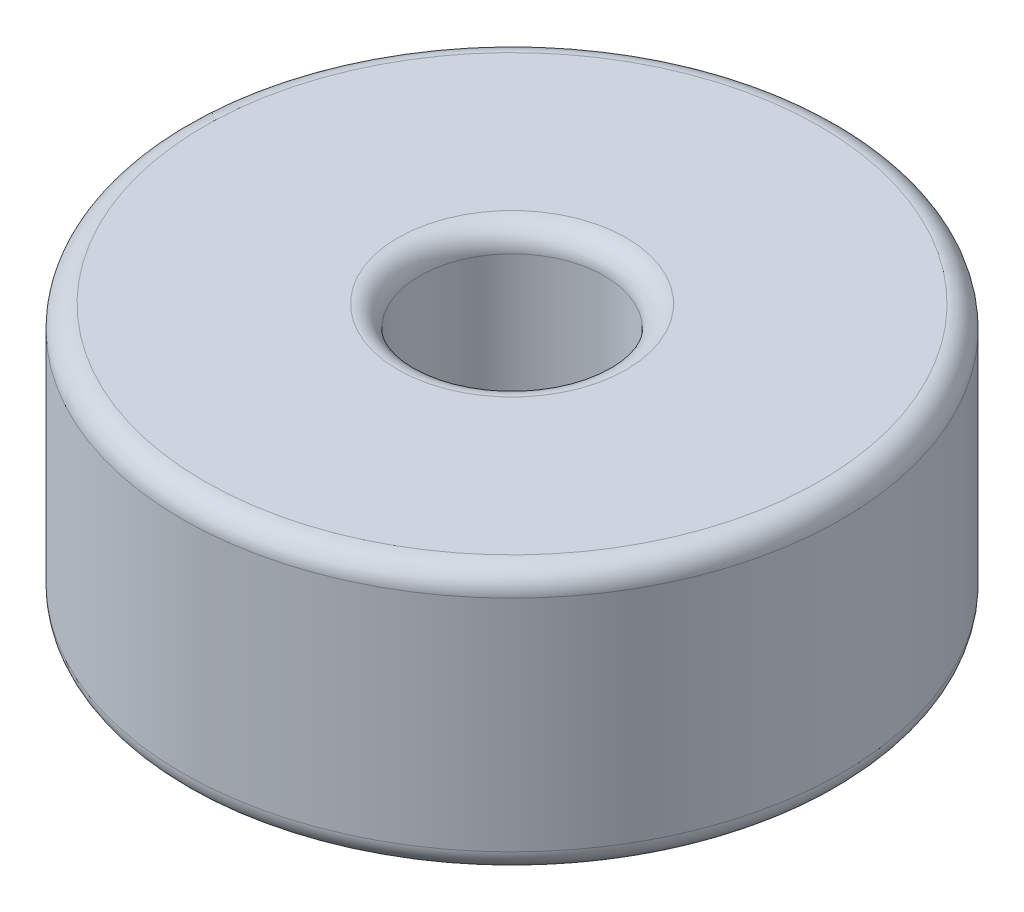
ISO-10303-21;
HEADER;
FILE_DESCRIPTION(('STEP AP214'),'2;1');
FILE_NAME('part.step','',(''),(''),'','','');
FILE_SCHEMA(('AUTOMOTIVE_DESIGN { 1 0 10303 214 1 1 1 1 }'));
ENDSEC;
DATA;
#1=APPLICATION_CONTEXT('core data for automotive mechanical design processes');
#2=APPLICATION_PROTOCOL_DEFINITION('international standard','automotive_design',2000,#1);
#3=PRODUCT_CONTEXT('',#1,'mechanical');
#4=PRODUCT('Part','Part','',(#3));
#5=PRODUCT_RELATED_PRODUCT_CATEGORY('part','',(#4));
#6=PRODUCT_DEFINITION_FORMATION('','',#4);
#7=PRODUCT_DEFINITION_CONTEXT('part definition',#1,'design');
#8=PRODUCT_DEFINITION('design','',#6,#7);
#9=PRODUCT_DEFINITION_SHAPE('','',#8);
#10=(LENGTH_UNIT() NAMED_UNIT(*) SI_UNIT(.MILLI.,.METRE.));
#11=(NAMED_UNIT(*) PLANE_ANGLE_UNIT() SI_UNIT($,.RADIAN.));
#12=(NAMED_UNIT(*) SI_UNIT($,.STERADIAN.) SOLID_ANGLE_UNIT());
#13=UNCERTAINTY_MEASURE_WITH_UNIT(LENGTH_MEASURE(1.E-05),#10,'distance_accuracy_value','');
#14=(GEOMETRIC_REPRESENTATION_CONTEXT(3) GLOBAL_UNCERTAINTY_ASSIGNED_CONTEXT((#13)) GLOBAL_UNIT_ASSIGNED_CONTEXT((#10,
#11,#12)) REPRESENTATION_CONTEXT('',''));
#15=CARTESIAN_POINT('',(0.,0.,0.));
#16=DIRECTION('',(0.,0.,1.));
#17=DIRECTION('',(1.,0.,0.));
#18=AXIS2_PLACEMENT_3D('',#15,#16,#17);
#19=CARTESIAN_POINT('',(0.,6.,0.));
#20=DIRECTION('',(0.,1.,0.));
#21=DIRECTION('',(0.,0.,1.));
#22=AXIS2_PLACEMENT_3D('',#19,#20,#21);
#23=PLANE('',#22);
#24=CARTESIAN_POINT('',(0.,6.,0.));
#25=DIRECTION('',(0.,1.,0.));
#26=DIRECTION('',(0.,0.,1.));
#27=AXIS2_PLACEMENT_3D('',#24,#25,#26);
#28=CIRCLE('',#27,7.);
#29=CARTESIAN_POINT('',(0.,6.,7.));
#30=VERTEX_POINT('',#29);
#31=EDGE_CURVE('E42',#30,#30,#28,.T.);
#32=ORIENTED_EDGE('',*,*,#31,.T.);
#33=EDGE_LOOP('',(#32));
#34=FACE_BOUND('',#33,.T.);
#35=CARTESIAN_POINT('',(0.,6.,0.));
#36=DIRECTION('',(0.,1.,0.));
#37=DIRECTION('',(0.,0.,1.));
#38=AXIS2_PLACEMENT_3D('',#35,#36,#37);
#39=CIRCLE('',#38,2.6);
#40=CARTESIAN_POINT('',(0.,6.,2.6));
#41=VERTEX_POINT('',#40);
#42=EDGE_CURVE('E46',#41,#41,#39,.F.);
#43=ORIENTED_EDGE('',*,*,#42,.T.);
#44=EDGE_LOOP('',(#43));
#45=FACE_BOUND('',#44,.T.);
#46=ADVANCED_FACE('F31',(#34,#45),#23,.T.);
#47=CARTESIAN_POINT('',(0.,0.,0.));
#48=DIRECTION('',(0.,1.,0.));
#49=DIRECTION('',(0.,0.,1.));
#50=AXIS2_PLACEMENT_3D('',#47,#48,#49);
#51=PLANE('',#50);
#52=CARTESIAN_POINT('',(0.,0.,0.));
#53=DIRECTION('',(0.,1.,0.));
#54=DIRECTION('',(0.,0.,1.));
#55=AXIS2_PLACEMENT_3D('',#52,#53,#54);
#56=CIRCLE('',#55,7.);
#57=CARTESIAN_POINT('',(0.,0.,7.));
#58=VERTEX_POINT('',#57);
#59=EDGE_CURVE('E51',#58,#58,#56,.F.);
#60=ORIENTED_EDGE('',*,*,#59,.T.);
#61=EDGE_LOOP('',(#60));
#62=FACE_BOUND('',#61,.T.);
#63=CARTESIAN_POINT('',(0.,0.,0.));
#64=DIRECTION('',(0.,1.,0.));
#65=DIRECTION('',(0.,0.,1.));
#66=AXIS2_PLACEMENT_3D('',#63,#64,#65);
#67=CIRCLE('',#66,2.6);
#68=CARTESIAN_POINT('',(0.,0.,2.6));
#69=VERTEX_POINT('',#68);
#70=EDGE_CURVE('E54',#69,#69,#67,.T.);
#71=ORIENTED_EDGE('',*,*,#70,.T.);
#72=EDGE_LOOP('',(#71));
#73=FACE_BOUND('',#72,.T.);
#74=ADVANCED_FACE('F76',(#62,#73),#51,.F.);
#75=CARTESIAN_POINT('',(0.,6.,0.));
#76=DIRECTION('',(0.,-1.,0.));
#77=DIRECTION('',(0.,0.,-1.));
#78=AXIS2_PLACEMENT_3D('',#75,#76,#77);
#79=CYLINDRICAL_SURFACE('',#78,7.5);
#80=CARTESIAN_POINT('',(0.,0.5,0.));
#81=DIRECTION('',(0.,1.,0.));
#82=DIRECTION('',(0.,0.,1.));
#83=AXIS2_PLACEMENT_3D('',#80,#81,#82);
#84=CIRCLE('',#83,7.5);
#85=CARTESIAN_POINT('',(0.,0.5,7.5));
#86=VERTEX_POINT('',#85);
#87=EDGE_CURVE('E57',#86,#86,#84,.T.);
#88=ORIENTED_EDGE('',*,*,#87,.T.);
#89=EDGE_LOOP('',(#88));
#90=FACE_BOUND('',#89,.T.);
#91=CARTESIAN_POINT('',(0.,5.5,0.));
#92=DIRECTION('',(0.,1.,0.));
#93=DIRECTION('',(0.,0.,1.));
#94=AXIS2_PLACEMENT_3D('',#91,#92,#93);
#95=CIRCLE('',#94,7.5);
#96=CARTESIAN_POINT('',(0.,5.5,7.5));
#97=VERTEX_POINT('',#96);
#98=EDGE_CURVE('E60',#97,#97,#95,.F.);
#99=ORIENTED_EDGE('',*,*,#98,.T.);
#100=EDGE_LOOP('',(#99));
#101=FACE_BOUND('',#100,.T.);
#102=ADVANCED_FACE('F64',(#90,#101),#79,.T.);
#103=CARTESIAN_POINT('',(0.,6.,0.));
#104=DIRECTION('',(0.,-1.,0.));
#105=DIRECTION('',(0.,0.,-1.));
#106=AXIS2_PLACEMENT_3D('',#103,#104,#105);
#107=CYLINDRICAL_SURFACE('',#106,2.1);
#108=CARTESIAN_POINT('',(0.,0.5,0.));
#109=DIRECTION('',(0.,1.,0.));
#110=DIRECTION('',(0.,0.,1.));
#111=AXIS2_PLACEMENT_3D('',#108,#109,#110);
#112=CIRCLE('',#111,2.1);
#113=CARTESIAN_POINT('',(0.,0.5,2.1));
#114=VERTEX_POINT('',#113);
#115=EDGE_CURVE('E10',#114,#114,#112,.F.);
#116=ORIENTED_EDGE('',*,*,#115,.T.);
#117=EDGE_LOOP('',(#116));
#118=FACE_BOUND('',#117,.T.);
#119=CARTESIAN_POINT('',(0.,5.5,0.));
#120=DIRECTION('',(0.,1.,0.));
#121=DIRECTION('',(0.,0.,1.));
#122=AXIS2_PLACEMENT_3D('',#119,#120,#121);
#123=CIRCLE('',#122,2.1);
#124=CARTESIAN_POINT('',(0.,5.5,2.1));
#125=VERTEX_POINT('',#124);
#126=EDGE_CURVE('E38',#125,#125,#123,.T.);
#127=ORIENTED_EDGE('',*,*,#126,.T.);
#128=EDGE_LOOP('',(#127));
#129=FACE_BOUND('',#128,.T.);
#130=ADVANCED_FACE('F92',(#118,#129),#107,.F.);
#131=CARTESIAN_POINT('',(0.,0.5,0.));
#132=DIRECTION('',(0.,1.,0.));
#133=DIRECTION('',(0.,0.,1.));
#134=AXIS2_PLACEMENT_3D('',#131,#132,#133);
#135=TOROIDAL_SURFACE('',#134,7.,0.5);
#136=ORIENTED_EDGE('',*,*,#59,.F.);
#137=EDGE_LOOP('',(#136));
#138=FACE_BOUND('',#137,.T.);
#139=ORIENTED_EDGE('',*,*,#87,.F.);
#140=EDGE_LOOP('',(#139));
#141=FACE_BOUND('',#140,.T.);
#142=ADVANCED_FACE('F70',(#138,#141),#135,.T.);
#143=CARTESIAN_POINT('',(0.,5.5,0.));
#144=DIRECTION('',(0.,1.,0.));
#145=DIRECTION('',(0.,0.,1.));
#146=AXIS2_PLACEMENT_3D('',#143,#144,#145);
#147=TOROIDAL_SURFACE('',#146,7.,0.5);
#148=ORIENTED_EDGE('',*,*,#98,.F.);
#149=EDGE_LOOP('',(#148));
#150=FACE_BOUND('',#149,.T.);
#151=ORIENTED_EDGE('',*,*,#31,.F.);
#152=EDGE_LOOP('',(#151));
#153=FACE_BOUND('',#152,.T.);
#154=ADVANCED_FACE('F66',(#150,#153),#147,.T.);
#155=CARTESIAN_POINT('',(0.,0.5,0.));
#156=DIRECTION('',(0.,1.,0.));
#157=DIRECTION('',(0.,0.,1.));
#158=AXIS2_PLACEMENT_3D('',#155,#156,#157);
#159=TOROIDAL_SURFACE('',#158,2.6,0.5);
#160=ORIENTED_EDGE('',*,*,#115,.F.);
#161=EDGE_LOOP('',(#160));
#162=FACE_BOUND('',#161,.T.);
#163=ORIENTED_EDGE('',*,*,#70,.F.);
#164=EDGE_LOOP('',(#163));
#165=FACE_BOUND('',#164,.T.);
#166=ADVANCED_FACE('F69',(#162,#165),#159,.T.);
#167=CARTESIAN_POINT('',(0.,5.5,0.));
#168=DIRECTION('',(0.,1.,0.));
#169=DIRECTION('',(0.,0.,1.));
#170=AXIS2_PLACEMENT_3D('',#167,#168,#169);
#171=TOROIDAL_SURFACE('',#170,2.6,0.5);
#172=ORIENTED_EDGE('',*,*,#42,.F.);
#173=EDGE_LOOP('',(#172));
#174=FACE_BOUND('',#173,.T.);
#175=ORIENTED_EDGE('',*,*,#126,.F.);
#176=EDGE_LOOP('',(#175));
#177=FACE_BOUND('',#176,.T.);
#178=ADVANCED_FACE('F33',(#174,#177),#171,.T.);
#179=CLOSED_SHELL('',(#46,#74,#102,#130,#142,#154,#166,#178));
#180=MANIFOLD_SOLID_BREP('B2',#179);
#181=ADVANCED_BREP_SHAPE_REPRESENTATION('',(#18,#180),#14);
#182=SHAPE_DEFINITION_REPRESENTATION(#9,#181);
ENDSEC;
END-ISO-10303-21;
